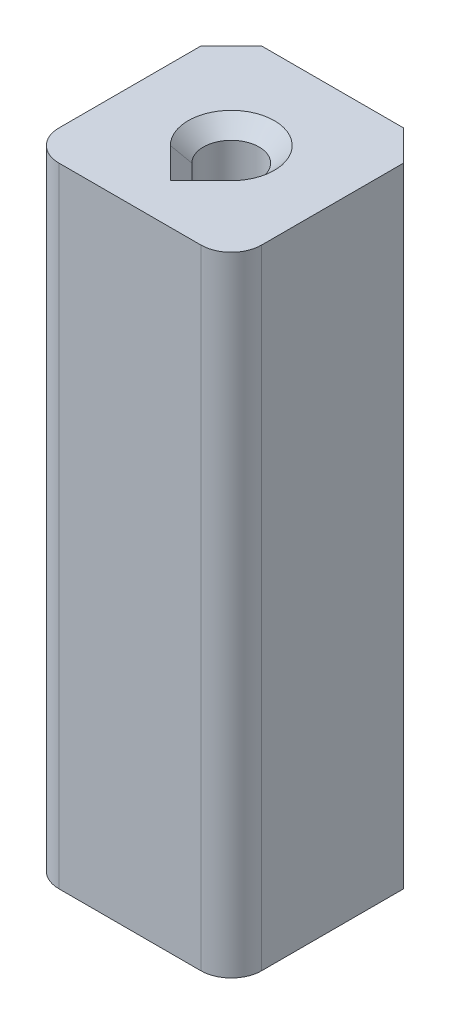
ISO-10303-21;
HEADER;
FILE_DESCRIPTION(('STEP AP214'),'2;1');
FILE_NAME('part.step','',(''),(''),'','','');
FILE_SCHEMA(('AUTOMOTIVE_DESIGN { 1 0 10303 214 1 1 1 1 }'));
ENDSEC;
DATA;
#1=APPLICATION_CONTEXT('core data for automotive mechanical design processes');
#2=APPLICATION_PROTOCOL_DEFINITION('international standard','automotive_design',2000,#1);
#3=PRODUCT_CONTEXT('',#1,'mechanical');
#4=PRODUCT('Part','Part','',(#3));
#5=PRODUCT_RELATED_PRODUCT_CATEGORY('part','',(#4));
#6=PRODUCT_DEFINITION_FORMATION('','',#4);
#7=PRODUCT_DEFINITION_CONTEXT('part definition',#1,'design');
#8=PRODUCT_DEFINITION('design','',#6,#7);
#9=PRODUCT_DEFINITION_SHAPE('','',#8);
#10=(LENGTH_UNIT() NAMED_UNIT(*) SI_UNIT(.MILLI.,.METRE.));
#11=(NAMED_UNIT(*) PLANE_ANGLE_UNIT() SI_UNIT($,.RADIAN.));
#12=(NAMED_UNIT(*) SI_UNIT($,.STERADIAN.) SOLID_ANGLE_UNIT());
#13=UNCERTAINTY_MEASURE_WITH_UNIT(LENGTH_MEASURE(1.E-05),#10,'distance_accuracy_value','');
#14=(GEOMETRIC_REPRESENTATION_CONTEXT(3) GLOBAL_UNCERTAINTY_ASSIGNED_CONTEXT((#13)) GLOBAL_UNIT_ASSIGNED_CONTEXT((#10,
#11,#12)) REPRESENTATION_CONTEXT('',''));
#15=CARTESIAN_POINT('',(0.,0.,0.));
#16=DIRECTION('',(0.,0.,1.));
#17=DIRECTION('',(1.,0.,0.));
#18=AXIS2_PLACEMENT_3D('',#15,#16,#17);
#19=CARTESIAN_POINT('',(-10.,62.,10.));
#20=DIRECTION('',(0.,0.,1.));
#21=DIRECTION('',(0.,-1.,0.));
#22=AXIS2_PLACEMENT_3D('',#19,#20,#21);
#23=PLANE('',#22);
#24=DIRECTION('',(1.,0.,0.));
#25=VECTOR('',#24,1.);
#26=CARTESIAN_POINT('',(-10.,62.,10.));
#27=LINE('',#26,#25);
#28=CARTESIAN_POINT('',(-7.,62.,10.));
#29=VERTEX_POINT('',#28);
#30=CARTESIAN_POINT('',(7.,62.,10.));
#31=VERTEX_POINT('',#30);
#32=EDGE_CURVE('E177',#29,#31,#27,.T.);
#33=ORIENTED_EDGE('',*,*,#32,.F.);
#34=DIRECTION('',(0.,-1.,0.));
#35=VECTOR('',#34,1.);
#36=CARTESIAN_POINT('',(-7.,0.,9.99999999999999));
#37=LINE('',#36,#35);
#38=CARTESIAN_POINT('',(-7.,0.,9.99999999999999));
#39=VERTEX_POINT('',#38);
#40=EDGE_CURVE('E194',#29,#39,#37,.T.);
#41=ORIENTED_EDGE('',*,*,#40,.T.);
#42=DIRECTION('',(1.,0.,0.));
#43=VECTOR('',#42,1.);
#44=CARTESIAN_POINT('',(-10.,0.,9.99999999999999));
#45=LINE('',#44,#43);
#46=CARTESIAN_POINT('',(7.,0.,9.99999999999999));
#47=VERTEX_POINT('',#46);
#48=EDGE_CURVE('E178',#39,#47,#45,.T.);
#49=ORIENTED_EDGE('',*,*,#48,.T.);
#50=DIRECTION('',(0.,-1.,0.));
#51=VECTOR('',#50,1.);
#52=CARTESIAN_POINT('',(7.,62.,10.));
#53=LINE('',#52,#51);
#54=EDGE_CURVE('E185',#47,#31,#53,.F.);
#55=ORIENTED_EDGE('',*,*,#54,.T.);
#56=EDGE_LOOP('',(#33,#41,#49,#55));
#57=FACE_BOUND('',#56,.T.);
#58=ADVANCED_FACE('F41',(#57),#23,.T.);
#59=CARTESIAN_POINT('',(-10.,62.,-9.99999999999999));
#60=DIRECTION('',(0.,1.,0.));
#61=DIRECTION('',(0.,0.,1.));
#62=AXIS2_PLACEMENT_3D('',#59,#60,#61);
#63=PLANE('',#62);
#64=CARTESIAN_POINT('',(0.,62.,0.));
#65=DIRECTION('',(0.,1.,0.));
#66=DIRECTION('',(0.,0.,1.));
#67=AXIS2_PLACEMENT_3D('',#64,#65,#66);
#68=CIRCLE('',#67,4.24999999999998);
#69=CARTESIAN_POINT('',(-3.00520382004283,62.,3.00520382004282));
#70=VERTEX_POINT('',#69);
#71=CARTESIAN_POINT('',(3.00520382004283,62.,3.00520382004282));
#72=VERTEX_POINT('',#71);
#73=EDGE_CURVE('E211',#70,#72,#68,.F.);
#74=ORIENTED_EDGE('',*,*,#73,.T.);
#75=DIRECTION('',(-0.707106781186544,0.,0.707106781186551));
#76=VECTOR('',#75,1.);
#77=CARTESIAN_POINT('',(1.06066017177982,62.,4.94974746830586));
#78=LINE('',#77,#76);
#79=CARTESIAN_POINT('',(0.,62.,6.01040764008569));
#80=VERTEX_POINT('',#79);
#81=EDGE_CURVE('E219',#72,#80,#78,.T.);
#82=ORIENTED_EDGE('',*,*,#81,.T.);
#83=DIRECTION('',(-0.707106781186544,0.,-0.707106781186551));
#84=VECTOR('',#83,1.);
#85=CARTESIAN_POINT('',(-3.00520382004283,62.,3.00520382004282));
#86=LINE('',#85,#84);
#87=EDGE_CURVE('E213',#80,#70,#86,.T.);
#88=ORIENTED_EDGE('',*,*,#87,.T.);
#89=EDGE_LOOP('',(#74,#82,#88));
#90=FACE_BOUND('',#89,.T.);
#91=DIRECTION('',(1.,0.,0.));
#92=VECTOR('',#91,1.);
#93=CARTESIAN_POINT('',(-10.,62.,-9.99999999999999));
#94=LINE('',#93,#92);
#95=CARTESIAN_POINT('',(-6.99999999999999,62.,-9.99999999999999));
#96=VERTEX_POINT('',#95);
#97=CARTESIAN_POINT('',(6.99999999999999,62.,-9.99999999999999));
#98=VERTEX_POINT('',#97);
#99=EDGE_CURVE('E182',#96,#98,#94,.T.);
#100=ORIENTED_EDGE('',*,*,#99,.F.);
#101=DIRECTION('',(-0.707106781186548,0.,0.707106781186548));
#102=VECTOR('',#101,1.);
#103=CARTESIAN_POINT('',(-8.49999999999999,62.,-8.49999999999999));
#104=LINE('',#103,#102);
#105=CARTESIAN_POINT('',(-10.,62.,-6.99999999999999));
#106=VERTEX_POINT('',#105);
#107=EDGE_CURVE('E235',#96,#106,#104,.T.);
#108=ORIENTED_EDGE('',*,*,#107,.T.);
#109=DIRECTION('',(0.,0.,1.));
#110=VECTOR('',#109,1.);
#111=CARTESIAN_POINT('',(-10.,62.,-9.99999999999999));
#112=LINE('',#111,#110);
#113=CARTESIAN_POINT('',(-10.,62.,7.));
#114=VERTEX_POINT('',#113);
#115=EDGE_CURVE('E176',#106,#114,#112,.T.);
#116=ORIENTED_EDGE('',*,*,#115,.T.);
#117=CARTESIAN_POINT('',(-7.,62.,7.));
#118=DIRECTION('',(0.,1.,0.));
#119=DIRECTION('',(0.,0.,1.));
#120=AXIS2_PLACEMENT_3D('',#117,#118,#119);
#121=CIRCLE('',#120,3.);
#122=EDGE_CURVE('E205',#114,#29,#121,.T.);
#123=ORIENTED_EDGE('',*,*,#122,.T.);
#124=ORIENTED_EDGE('',*,*,#32,.T.);
#125=CARTESIAN_POINT('',(7.,62.,7.));
#126=DIRECTION('',(0.,1.,0.));
#127=DIRECTION('',(0.,0.,1.));
#128=AXIS2_PLACEMENT_3D('',#125,#126,#127);
#129=CIRCLE('',#128,3.);
#130=CARTESIAN_POINT('',(10.,62.,7.));
#131=VERTEX_POINT('',#130);
#132=EDGE_CURVE('E203',#31,#131,#129,.T.);
#133=ORIENTED_EDGE('',*,*,#132,.T.);
#134=DIRECTION('',(0.,0.,1.));
#135=VECTOR('',#134,1.);
#136=CARTESIAN_POINT('',(10.,62.,-9.99999999999999));
#137=LINE('',#136,#135);
#138=CARTESIAN_POINT('',(10.,62.,-6.99999999999999));
#139=VERTEX_POINT('',#138);
#140=EDGE_CURVE('E175',#139,#131,#137,.T.);
#141=ORIENTED_EDGE('',*,*,#140,.F.);
#142=DIRECTION('',(0.707106781186548,0.,0.707106781186548));
#143=VECTOR('',#142,1.);
#144=CARTESIAN_POINT('',(-1.5,62.,-18.5));
#145=LINE('',#144,#143);
#146=EDGE_CURVE('E229',#139,#98,#145,.F.);
#147=ORIENTED_EDGE('',*,*,#146,.T.);
#148=EDGE_LOOP('',(#100,#108,#116,#123,#124,#133,#141,#147));
#149=FACE_BOUND('',#148,.T.);
#150=ADVANCED_FACE('F244',(#90,#149),#63,.T.);
#151=CARTESIAN_POINT('',(-10.,0.,-9.99999999999999));
#152=DIRECTION('',(0.,0.,-1.));
#153=DIRECTION('',(0.,1.,0.));
#154=AXIS2_PLACEMENT_3D('',#151,#152,#153);
#155=PLANE('',#154);
#156=DIRECTION('',(1.,0.,0.));
#157=VECTOR('',#156,1.);
#158=CARTESIAN_POINT('',(-10.,0.,-9.99999999999999));
#159=LINE('',#158,#157);
#160=CARTESIAN_POINT('',(-6.99999999999999,0.,-9.99999999999999));
#161=VERTEX_POINT('',#160);
#162=CARTESIAN_POINT('',(6.99999999999999,0.,-9.99999999999999));
#163=VERTEX_POINT('',#162);
#164=EDGE_CURVE('E187',#161,#163,#159,.T.);
#165=ORIENTED_EDGE('',*,*,#164,.F.);
#166=DIRECTION('',(0.,1.,0.));
#167=VECTOR('',#166,1.);
#168=CARTESIAN_POINT('',(-6.99999999999999,62.,-9.99999999999999));
#169=LINE('',#168,#167);
#170=EDGE_CURVE('E227',#161,#96,#169,.T.);
#171=ORIENTED_EDGE('',*,*,#170,.T.);
#172=ORIENTED_EDGE('',*,*,#99,.T.);
#173=DIRECTION('',(0.,-1.,0.));
#174=VECTOR('',#173,1.);
#175=CARTESIAN_POINT('',(6.99999999999999,0.,-9.99999999999999));
#176=LINE('',#175,#174);
#177=EDGE_CURVE('E224',#98,#163,#176,.T.);
#178=ORIENTED_EDGE('',*,*,#177,.T.);
#179=EDGE_LOOP('',(#165,#171,#172,#178));
#180=FACE_BOUND('',#179,.T.);
#181=ADVANCED_FACE('F239',(#180),#155,.T.);
#182=CARTESIAN_POINT('',(-10.,0.,9.99999999999999));
#183=DIRECTION('',(0.,-1.,0.));
#184=DIRECTION('',(0.,0.,-1.));
#185=AXIS2_PLACEMENT_3D('',#182,#183,#184);
#186=PLANE('',#185);
#187=CARTESIAN_POINT('',(0.,0.,0.));
#188=DIRECTION('',(0.,1.,0.));
#189=DIRECTION('',(0.,0.,1.));
#190=AXIS2_PLACEMENT_3D('',#187,#188,#189);
#191=CIRCLE('',#190,2.75);
#192=CARTESIAN_POINT('',(1.94454364826302,0.,1.94454364826299));
#193=VERTEX_POINT('',#192);
#194=CARTESIAN_POINT('',(-1.94454364826302,0.,1.944543648263));
#195=VERTEX_POINT('',#194);
#196=EDGE_CURVE('E141',#193,#195,#191,.T.);
#197=ORIENTED_EDGE('',*,*,#196,.T.);
#198=DIRECTION('',(0.707106781186544,0.,0.707106781186551));
#199=VECTOR('',#198,1.);
#200=CARTESIAN_POINT('',(-1.94454364826302,0.,1.94454364826299));
#201=LINE('',#200,#199);
#202=CARTESIAN_POINT('',(0.,0.,3.88908729652603));
#203=VERTEX_POINT('',#202);
#204=EDGE_CURVE('E153',#195,#203,#201,.T.);
#205=ORIENTED_EDGE('',*,*,#204,.T.);
#206=DIRECTION('',(0.707106781186544,0.,-0.707106781186551));
#207=VECTOR('',#206,1.);
#208=CARTESIAN_POINT('',(1.94454364826302,0.,1.94454364826299));
#209=LINE('',#208,#207);
#210=EDGE_CURVE('E147',#203,#193,#209,.T.);
#211=ORIENTED_EDGE('',*,*,#210,.T.);
#212=EDGE_LOOP('',(#197,#205,#211));
#213=FACE_BOUND('',#212,.T.);
#214=DIRECTION('',(0.,0.,-1.));
#215=VECTOR('',#214,1.);
#216=CARTESIAN_POINT('',(-10.,0.,9.99999999999999));
#217=LINE('',#216,#215);
#218=CARTESIAN_POINT('',(-10.,0.,6.99999999999999));
#219=VERTEX_POINT('',#218);
#220=CARTESIAN_POINT('',(-10.,0.,-6.99999999999998));
#221=VERTEX_POINT('',#220);
#222=EDGE_CURVE('E172',#219,#221,#217,.T.);
#223=ORIENTED_EDGE('',*,*,#222,.T.);
#224=DIRECTION('',(0.707106781186548,0.,-0.707106781186548));
#225=VECTOR('',#224,1.);
#226=CARTESIAN_POINT('',(-18.5,0.,1.5));
#227=LINE('',#226,#225);
#228=EDGE_CURVE('E49',#221,#161,#227,.T.);
#229=ORIENTED_EDGE('',*,*,#228,.T.);
#230=ORIENTED_EDGE('',*,*,#164,.T.);
#231=DIRECTION('',(-0.707106781186548,0.,-0.707106781186548));
#232=VECTOR('',#231,1.);
#233=CARTESIAN_POINT('',(8.49999999999999,0.,-8.49999999999999));
#234=LINE('',#233,#232);
#235=CARTESIAN_POINT('',(10.,0.,-6.99999999999998));
#236=VERTEX_POINT('',#235);
#237=EDGE_CURVE('E60',#163,#236,#234,.F.);
#238=ORIENTED_EDGE('',*,*,#237,.T.);
#239=DIRECTION('',(0.,0.,-1.));
#240=VECTOR('',#239,1.);
#241=CARTESIAN_POINT('',(10.,0.,9.99999999999999));
#242=LINE('',#241,#240);
#243=CARTESIAN_POINT('',(10.,0.,6.99999999999999));
#244=VERTEX_POINT('',#243);
#245=EDGE_CURVE('E169',#244,#236,#242,.T.);
#246=ORIENTED_EDGE('',*,*,#245,.F.);
#247=CARTESIAN_POINT('',(7.,0.,6.99999999999999));
#248=DIRECTION('',(0.,-1.,0.));
#249=DIRECTION('',(0.,0.,-1.));
#250=AXIS2_PLACEMENT_3D('',#247,#248,#249);
#251=CIRCLE('',#250,3.);
#252=EDGE_CURVE('E193',#244,#47,#251,.T.);
#253=ORIENTED_EDGE('',*,*,#252,.T.);
#254=ORIENTED_EDGE('',*,*,#48,.F.);
#255=CARTESIAN_POINT('',(-7.,0.,6.99999999999999));
#256=DIRECTION('',(0.,-1.,0.));
#257=DIRECTION('',(0.,0.,-1.));
#258=AXIS2_PLACEMENT_3D('',#255,#256,#257);
#259=CIRCLE('',#258,3.);
#260=EDGE_CURVE('E199',#39,#219,#259,.T.);
#261=ORIENTED_EDGE('',*,*,#260,.T.);
#262=EDGE_LOOP('',(#223,#229,#230,#238,#246,#253,#254,#261));
#263=FACE_BOUND('',#262,.T.);
#264=ADVANCED_FACE('F160',(#213,#263),#186,.T.);
#265=CARTESIAN_POINT('',(-10.,0.,0.));
#266=DIRECTION('',(1.,0.,0.));
#267=DIRECTION('',(0.,0.,-1.));
#268=AXIS2_PLACEMENT_3D('',#265,#266,#267);
#269=PLANE('',#268);
#270=ORIENTED_EDGE('',*,*,#115,.F.);
#271=DIRECTION('',(0.,-1.,0.));
#272=VECTOR('',#271,1.);
#273=CARTESIAN_POINT('',(-10.,0.,-6.99999999999998));
#274=LINE('',#273,#272);
#275=EDGE_CURVE('E62',#106,#221,#274,.T.);
#276=ORIENTED_EDGE('',*,*,#275,.T.);
#277=ORIENTED_EDGE('',*,*,#222,.F.);
#278=DIRECTION('',(0.,-1.,0.));
#279=VECTOR('',#278,1.);
#280=CARTESIAN_POINT('',(-10.,62.,7.));
#281=LINE('',#280,#279);
#282=EDGE_CURVE('E200',#219,#114,#281,.F.);
#283=ORIENTED_EDGE('',*,*,#282,.T.);
#284=EDGE_LOOP('',(#270,#276,#277,#283));
#285=FACE_BOUND('',#284,.T.);
#286=ADVANCED_FACE('F246',(#285),#269,.F.);
#287=CARTESIAN_POINT('',(10.,0.,0.));
#288=DIRECTION('',(1.,0.,0.));
#289=DIRECTION('',(0.,0.,-1.));
#290=AXIS2_PLACEMENT_3D('',#287,#288,#289);
#291=PLANE('',#290);
#292=ORIENTED_EDGE('',*,*,#245,.T.);
#293=DIRECTION('',(0.,1.,0.));
#294=VECTOR('',#293,1.);
#295=CARTESIAN_POINT('',(10.,0.,-6.99999999999998));
#296=LINE('',#295,#294);
#297=EDGE_CURVE('E11',#236,#139,#296,.T.);
#298=ORIENTED_EDGE('',*,*,#297,.T.);
#299=ORIENTED_EDGE('',*,*,#140,.T.);
#300=DIRECTION('',(0.,-1.,0.));
#301=VECTOR('',#300,1.);
#302=CARTESIAN_POINT('',(10.,0.,6.99999999999999));
#303=LINE('',#302,#301);
#304=EDGE_CURVE('E207',#131,#244,#303,.T.);
#305=ORIENTED_EDGE('',*,*,#304,.T.);
#306=EDGE_LOOP('',(#292,#298,#299,#305));
#307=FACE_BOUND('',#306,.T.);
#308=ADVANCED_FACE('F261',(#307),#291,.T.);
#309=CARTESIAN_POINT('',(-7.,62.,7.));
#310=DIRECTION('',(0.,1.,0.));
#311=DIRECTION('',(0.,0.,1.));
#312=AXIS2_PLACEMENT_3D('',#309,#310,#311);
#313=CYLINDRICAL_SURFACE('',#312,3.);
#314=ORIENTED_EDGE('',*,*,#122,.F.);
#315=ORIENTED_EDGE('',*,*,#282,.F.);
#316=ORIENTED_EDGE('',*,*,#260,.F.);
#317=ORIENTED_EDGE('',*,*,#40,.F.);
#318=EDGE_LOOP('',(#314,#315,#316,#317));
#319=FACE_BOUND('',#318,.T.);
#320=ADVANCED_FACE('F252',(#319),#313,.T.);
#321=CARTESIAN_POINT('',(7.,0.,6.99999999999999));
#322=DIRECTION('',(0.,-1.,0.));
#323=DIRECTION('',(0.,0.,-1.));
#324=AXIS2_PLACEMENT_3D('',#321,#322,#323);
#325=CYLINDRICAL_SURFACE('',#324,3.);
#326=ORIENTED_EDGE('',*,*,#132,.F.);
#327=ORIENTED_EDGE('',*,*,#54,.F.);
#328=ORIENTED_EDGE('',*,*,#252,.F.);
#329=ORIENTED_EDGE('',*,*,#304,.F.);
#330=EDGE_LOOP('',(#326,#327,#328,#329));
#331=FACE_BOUND('',#330,.T.);
#332=ADVANCED_FACE('F260',(#331),#325,.T.);
#333=CARTESIAN_POINT('',(0.,0.,0.));
#334=DIRECTION('',(0.,1.,0.));
#335=DIRECTION('',(0.,0.,1.));
#336=AXIS2_PLACEMENT_3D('',#333,#334,#335);
#337=CYLINDRICAL_SURFACE('',#336,2.75);
#338=DIRECTION('',(0.,1.,0.));
#339=VECTOR('',#338,1.);
#340=CARTESIAN_POINT('',(1.94454364826302,0.,1.94454364826299));
#341=LINE('',#340,#339);
#342=CARTESIAN_POINT('',(1.94454364826302,60.5,1.94454364826302));
#343=VERTEX_POINT('',#342);
#344=EDGE_CURVE('E170',#193,#343,#341,.T.);
#345=ORIENTED_EDGE('',*,*,#344,.T.);
#346=CARTESIAN_POINT('',(0.,60.5,0.));
#347=DIRECTION('',(0.,1.,0.));
#348=DIRECTION('',(0.,0.,1.));
#349=AXIS2_PLACEMENT_3D('',#346,#347,#348);
#350=CIRCLE('',#349,2.75);
#351=CARTESIAN_POINT('',(-1.94454364826302,60.5,1.94454364826302));
#352=VERTEX_POINT('',#351);
#353=EDGE_CURVE('E149',#343,#352,#350,.T.);
#354=ORIENTED_EDGE('',*,*,#353,.T.);
#355=DIRECTION('',(0.,1.,0.));
#356=VECTOR('',#355,1.);
#357=CARTESIAN_POINT('',(-1.94454364826302,0.,1.944543648263));
#358=LINE('',#357,#356);
#359=EDGE_CURVE('E137',#195,#352,#358,.T.);
#360=ORIENTED_EDGE('',*,*,#359,.F.);
#361=ORIENTED_EDGE('',*,*,#196,.F.);
#362=EDGE_LOOP('',(#345,#354,#360,#361));
#363=FACE_BOUND('',#362,.T.);
#364=ADVANCED_FACE('F142',(#363),#337,.F.);
#365=CARTESIAN_POINT('',(1.94454364826302,0.,1.94454364826299));
#366=DIRECTION('',(0.707106781186552,0.,0.707106781186544));
#367=DIRECTION('',(0.707106781186544,0.,-0.707106781186551));
#368=AXIS2_PLACEMENT_3D('',#365,#366,#367);
#369=PLANE('',#368);
#370=DIRECTION('',(0.,1.,0.));
#371=VECTOR('',#370,1.);
#372=CARTESIAN_POINT('',(0.,0.,3.88908729652603));
#373=LINE('',#372,#371);
#374=CARTESIAN_POINT('',(0.,60.5,3.88908729652605));
#375=VERTEX_POINT('',#374);
#376=EDGE_CURVE('E148',#203,#375,#373,.T.);
#377=ORIENTED_EDGE('',*,*,#376,.T.);
#378=DIRECTION('',(0.707106781186544,0.,-0.707106781186551));
#379=VECTOR('',#378,1.);
#380=CARTESIAN_POINT('',(1.94454364826301,60.5,1.94454364826302));
#381=LINE('',#380,#379);
#382=EDGE_CURVE('E209',#375,#343,#381,.T.);
#383=ORIENTED_EDGE('',*,*,#382,.T.);
#384=ORIENTED_EDGE('',*,*,#344,.F.);
#385=ORIENTED_EDGE('',*,*,#210,.F.);
#386=EDGE_LOOP('',(#377,#383,#384,#385));
#387=FACE_BOUND('',#386,.T.);
#388=ADVANCED_FACE('F311',(#387),#369,.F.);
#389=CARTESIAN_POINT('',(-1.94454364826302,0.,1.94454364826299));
#390=DIRECTION('',(-0.707106781186551,0.,0.707106781186544));
#391=DIRECTION('',(0.707106781186544,0.,0.707106781186551));
#392=AXIS2_PLACEMENT_3D('',#389,#390,#391);
#393=PLANE('',#392);
#394=ORIENTED_EDGE('',*,*,#359,.T.);
#395=DIRECTION('',(0.707106781186544,0.,0.707106781186551));
#396=VECTOR('',#395,1.);
#397=CARTESIAN_POINT('',(0.,60.5,3.88908729652605));
#398=LINE('',#397,#396);
#399=EDGE_CURVE('E218',#352,#375,#398,.T.);
#400=ORIENTED_EDGE('',*,*,#399,.T.);
#401=ORIENTED_EDGE('',*,*,#376,.F.);
#402=ORIENTED_EDGE('',*,*,#204,.F.);
#403=EDGE_LOOP('',(#394,#400,#401,#402));
#404=FACE_BOUND('',#403,.T.);
#405=ADVANCED_FACE('F152',(#404),#393,.F.);
#406=CARTESIAN_POINT('',(-1.94454364826302,60.5,1.94454364826302));
#407=DIRECTION('',(0.500000000000004,0.707106781186546,-0.499999999999998));
#408=DIRECTION('',(-0.707106781186544,0.,-0.707106781186551));
#409=AXIS2_PLACEMENT_3D('',#406,#407,#408);
#410=PLANE('',#409);
#411=DIRECTION('',(0.,-0.577350269189625,-0.816496580927727));
#412=VECTOR('',#411,1.);
#413=CARTESIAN_POINT('',(0.,59.5833333333333,2.59272486435069));
#414=LINE('',#413,#412);
#415=EDGE_CURVE('E161',#375,#80,#414,.F.);
#416=ORIENTED_EDGE('',*,*,#415,.F.);
#417=ORIENTED_EDGE('',*,*,#399,.F.);
#418=DIRECTION('',(0.500000000000002,-0.707106781186548,-0.499999999999997));
#419=VECTOR('',#418,1.);
#420=CARTESIAN_POINT('',(-3.00520382004283,62.,3.00520382004282));
#421=LINE('',#420,#419);
#422=EDGE_CURVE('E156',#70,#352,#421,.T.);
#423=ORIENTED_EDGE('',*,*,#422,.F.);
#424=ORIENTED_EDGE('',*,*,#87,.F.);
#425=EDGE_LOOP('',(#416,#417,#423,#424));
#426=FACE_BOUND('',#425,.T.);
#427=ADVANCED_FACE('F296',(#426),#410,.T.);
#428=CARTESIAN_POINT('',(0.,60.5,0.));
#429=DIRECTION('',(0.,1.,0.));
#430=DIRECTION('',(0.,0.,1.));
#431=AXIS2_PLACEMENT_3D('',#428,#429,#430);
#432=CONICAL_SURFACE('',#431,2.75,0.785398163397447);
#433=ORIENTED_EDGE('',*,*,#422,.T.);
#434=ORIENTED_EDGE('',*,*,#353,.F.);
#435=DIRECTION('',(-0.500000000000003,-0.707106781186547,-0.499999999999997));
#436=VECTOR('',#435,1.);
#437=CARTESIAN_POINT('',(3.00520382004283,62.,3.00520382004282));
#438=LINE('',#437,#436);
#439=EDGE_CURVE('E222',#72,#343,#438,.T.);
#440=ORIENTED_EDGE('',*,*,#439,.F.);
#441=ORIENTED_EDGE('',*,*,#73,.F.);
#442=EDGE_LOOP('',(#433,#434,#440,#441));
#443=FACE_BOUND('',#442,.T.);
#444=ADVANCED_FACE('F293',(#443),#432,.F.);
#445=CARTESIAN_POINT('',(1.94454364826302,60.5,1.94454364826301));
#446=DIRECTION('',(-0.500000000000003,0.707106781186547,-0.499999999999998));
#447=DIRECTION('',(-0.707106781186544,0.,0.707106781186551));
#448=AXIS2_PLACEMENT_3D('',#445,#446,#447);
#449=PLANE('',#448);
#450=ORIENTED_EDGE('',*,*,#415,.T.);
#451=ORIENTED_EDGE('',*,*,#81,.F.);
#452=ORIENTED_EDGE('',*,*,#439,.T.);
#453=ORIENTED_EDGE('',*,*,#382,.F.);
#454=EDGE_LOOP('',(#450,#451,#452,#453));
#455=FACE_BOUND('',#454,.T.);
#456=ADVANCED_FACE('F270',(#455),#449,.T.);
#457=CARTESIAN_POINT('',(-6.99999999999999,0.,-9.99999999999999));
#458=DIRECTION('',(-0.707106781186547,0.,-0.707106781186547));
#459=DIRECTION('',(0.,-1.,0.));
#460=AXIS2_PLACEMENT_3D('',#457,#458,#459);
#461=PLANE('',#460);
#462=ORIENTED_EDGE('',*,*,#228,.F.);
#463=ORIENTED_EDGE('',*,*,#275,.F.);
#464=ORIENTED_EDGE('',*,*,#107,.F.);
#465=ORIENTED_EDGE('',*,*,#170,.F.);
#466=EDGE_LOOP('',(#462,#463,#464,#465));
#467=FACE_BOUND('',#466,.T.);
#468=ADVANCED_FACE('F243',(#467),#461,.T.);
#469=CARTESIAN_POINT('',(10.,0.,-6.99999999999998));
#470=DIRECTION('',(-0.707106781186547,0.,0.707106781186547));
#471=DIRECTION('',(0.,1.,0.));
#472=AXIS2_PLACEMENT_3D('',#469,#470,#471);
#473=PLANE('',#472);
#474=ORIENTED_EDGE('',*,*,#237,.F.);
#475=ORIENTED_EDGE('',*,*,#177,.F.);
#476=ORIENTED_EDGE('',*,*,#146,.F.);
#477=ORIENTED_EDGE('',*,*,#297,.F.);
#478=EDGE_LOOP('',(#474,#475,#476,#477));
#479=FACE_BOUND('',#478,.T.);
#480=ADVANCED_FACE('F42',(#479),#473,.F.);
#481=CLOSED_SHELL('',(#58,#150,#181,#264,#286,#308,#320,#332,#364,#388,#405,#427,#444,#456,#468,#480));
#482=MANIFOLD_SOLID_BREP('B2',#481);
#483=ADVANCED_BREP_SHAPE_REPRESENTATION('',(#18,#482),#14);
#484=SHAPE_DEFINITION_REPRESENTATION(#9,#483);
ENDSEC;
END-ISO-10303-21;
